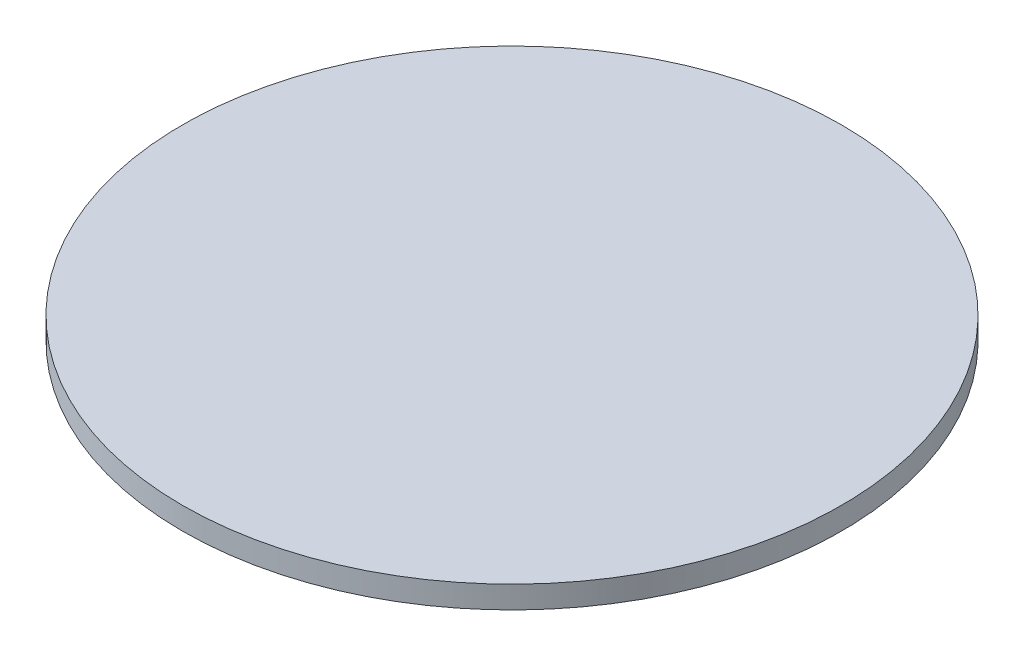
ISO-10303-21;
HEADER;
FILE_DESCRIPTION(('STEP AP214'),'2;1');
FILE_NAME('part.step','',(''),(''),'','','');
FILE_SCHEMA(('AUTOMOTIVE_DESIGN { 1 0 10303 214 1 1 1 1 }'));
ENDSEC;
DATA;
#1=APPLICATION_CONTEXT('core data for automotive mechanical design processes');
#2=APPLICATION_PROTOCOL_DEFINITION('international standard','automotive_design',2000,#1);
#3=PRODUCT_CONTEXT('',#1,'mechanical');
#4=PRODUCT('Part','Part','',(#3));
#5=PRODUCT_RELATED_PRODUCT_CATEGORY('part','',(#4));
#6=PRODUCT_DEFINITION_FORMATION('','',#4);
#7=PRODUCT_DEFINITION_CONTEXT('part definition',#1,'design');
#8=PRODUCT_DEFINITION('design','',#6,#7);
#9=PRODUCT_DEFINITION_SHAPE('','',#8);
#10=(LENGTH_UNIT() NAMED_UNIT(*) SI_UNIT(.MILLI.,.METRE.));
#11=(NAMED_UNIT(*) PLANE_ANGLE_UNIT() SI_UNIT($,.RADIAN.));
#12=(NAMED_UNIT(*) SI_UNIT($,.STERADIAN.) SOLID_ANGLE_UNIT());
#13=UNCERTAINTY_MEASURE_WITH_UNIT(LENGTH_MEASURE(1.E-05),#10,'distance_accuracy_value','');
#14=(GEOMETRIC_REPRESENTATION_CONTEXT(3) GLOBAL_UNCERTAINTY_ASSIGNED_CONTEXT((#13)) GLOBAL_UNIT_ASSIGNED_CONTEXT((#10,
#11,#12)) REPRESENTATION_CONTEXT('',''));
#15=CARTESIAN_POINT('',(0.,0.,0.));
#16=DIRECTION('',(0.,0.,1.));
#17=DIRECTION('',(1.,0.,0.));
#18=AXIS2_PLACEMENT_3D('',#15,#16,#17);
#19=CARTESIAN_POINT('',(0.,8.,0.));
#20=DIRECTION('',(0.,-1.,0.));
#21=DIRECTION('',(0.,0.,-1.));
#22=AXIS2_PLACEMENT_3D('',#19,#20,#21);
#23=CYLINDRICAL_SURFACE('',#22,118.);
#24=CARTESIAN_POINT('',(0.,8.,0.));
#25=DIRECTION('',(0.,1.,0.));
#26=DIRECTION('',(0.,0.,1.));
#27=AXIS2_PLACEMENT_3D('',#24,#25,#26);
#28=CIRCLE('',#27,118.);
#29=CARTESIAN_POINT('',(0.,8.,118.));
#30=VERTEX_POINT('',#29);
#31=EDGE_CURVE('E10',#30,#30,#28,.T.);
#32=ORIENTED_EDGE('',*,*,#31,.F.);
#33=EDGE_LOOP('',(#32));
#34=FACE_BOUND('',#33,.T.);
#35=CARTESIAN_POINT('',(0.,0.,0.));
#36=DIRECTION('',(0.,1.,0.));
#37=DIRECTION('',(0.,0.,1.));
#38=AXIS2_PLACEMENT_3D('',#35,#36,#37);
#39=CIRCLE('',#38,118.);
#40=CARTESIAN_POINT('',(0.,0.,118.));
#41=VERTEX_POINT('',#40);
#42=EDGE_CURVE('E44',#41,#41,#39,.T.);
#43=ORIENTED_EDGE('',*,*,#42,.T.);
#44=EDGE_LOOP('',(#43));
#45=FACE_BOUND('',#44,.T.);
#46=ADVANCED_FACE('F41',(#34,#45),#23,.T.);
#47=CARTESIAN_POINT('',(0.,8.,0.));
#48=DIRECTION('',(0.,1.,0.));
#49=DIRECTION('',(0.,0.,1.));
#50=AXIS2_PLACEMENT_3D('',#47,#48,#49);
#51=PLANE('',#50);
#52=ORIENTED_EDGE('',*,*,#31,.T.);
#53=EDGE_LOOP('',(#52));
#54=FACE_BOUND('',#53,.T.);
#55=ADVANCED_FACE('F58',(#54),#51,.T.);
#56=CARTESIAN_POINT('',(0.,0.,0.));
#57=DIRECTION('',(0.,1.,0.));
#58=DIRECTION('',(0.,0.,1.));
#59=AXIS2_PLACEMENT_3D('',#56,#57,#58);
#60=PLANE('',#59);
#61=ORIENTED_EDGE('',*,*,#42,.F.);
#62=EDGE_LOOP('',(#61));
#63=FACE_BOUND('',#62,.T.);
#64=ADVANCED_FACE('F56',(#63),#60,.F.);
#65=CLOSED_SHELL('',(#46,#55,#64));
#66=MANIFOLD_SOLID_BREP('B2',#65);
#67=ADVANCED_BREP_SHAPE_REPRESENTATION('',(#18,#66),#14);
#68=SHAPE_DEFINITION_REPRESENTATION(#9,#67);
ENDSEC;
END-ISO-10303-21;
